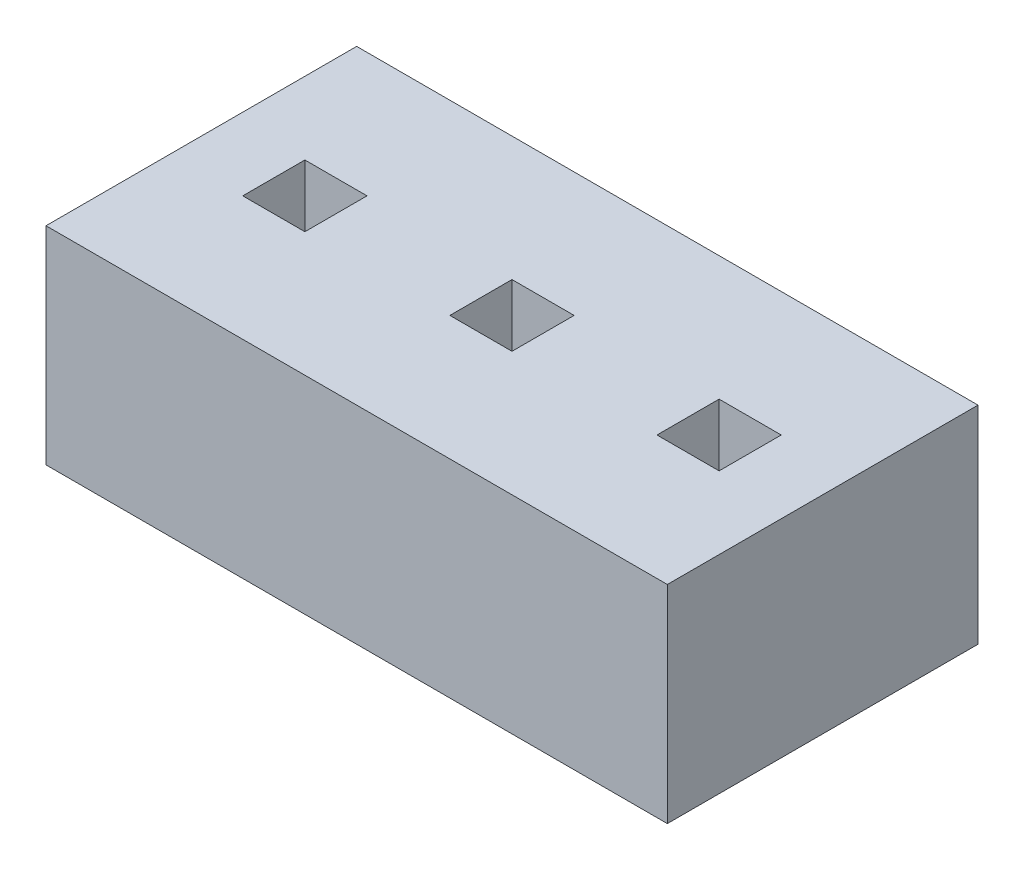
ISO-10303-21;
HEADER;
FILE_DESCRIPTION(('STEP AP214'),'2;1');
FILE_NAME('part.step','',(''),(''),'','','');
FILE_SCHEMA(('AUTOMOTIVE_DESIGN { 1 0 10303 214 1 1 1 1 }'));
ENDSEC;
DATA;
#1=APPLICATION_CONTEXT('core data for automotive mechanical design processes');
#2=APPLICATION_PROTOCOL_DEFINITION('international standard','automotive_design',2000,#1);
#3=PRODUCT_CONTEXT('',#1,'mechanical');
#4=PRODUCT('Part','Part','',(#3));
#5=PRODUCT_RELATED_PRODUCT_CATEGORY('part','',(#4));
#6=PRODUCT_DEFINITION_FORMATION('','',#4);
#7=PRODUCT_DEFINITION_CONTEXT('part definition',#1,'design');
#8=PRODUCT_DEFINITION('design','',#6,#7);
#9=PRODUCT_DEFINITION_SHAPE('','',#8);
#10=(LENGTH_UNIT() NAMED_UNIT(*) SI_UNIT(.MILLI.,.METRE.));
#11=(NAMED_UNIT(*) PLANE_ANGLE_UNIT() SI_UNIT($,.RADIAN.));
#12=(NAMED_UNIT(*) SI_UNIT($,.STERADIAN.) SOLID_ANGLE_UNIT());
#13=UNCERTAINTY_MEASURE_WITH_UNIT(LENGTH_MEASURE(1.E-05),#10,'distance_accuracy_value','');
#14=(GEOMETRIC_REPRESENTATION_CONTEXT(3) GLOBAL_UNCERTAINTY_ASSIGNED_CONTEXT((#13)) GLOBAL_UNIT_ASSIGNED_CONTEXT((#10,
#11,#12)) REPRESENTATION_CONTEXT('',''));
#15=CARTESIAN_POINT('',(0.,0.,0.));
#16=DIRECTION('',(0.,0.,1.));
#17=DIRECTION('',(1.,0.,0.));
#18=AXIS2_PLACEMENT_3D('',#15,#16,#17);
#19=CARTESIAN_POINT('',(0.,1.,0.));
#20=DIRECTION('',(1.,0.,0.));
#21=DIRECTION('',(0.,0.,-1.));
#22=AXIS2_PLACEMENT_3D('',#19,#20,#21);
#23=PLANE('',#22);
#24=DIRECTION('',(0.,0.,1.));
#25=VECTOR('',#24,1.);
#26=CARTESIAN_POINT('',(0.,0.,0.));
#27=LINE('',#26,#25);
#28=CARTESIAN_POINT('',(0.,0.,0.));
#29=VERTEX_POINT('',#28);
#30=CARTESIAN_POINT('',(0.,0.,1.5));
#31=VERTEX_POINT('',#30);
#32=EDGE_CURVE('E11',#29,#31,#27,.T.);
#33=ORIENTED_EDGE('',*,*,#32,.T.);
#34=DIRECTION('',(0.,-1.,0.));
#35=VECTOR('',#34,1.);
#36=CARTESIAN_POINT('',(0.,1.,1.5));
#37=LINE('',#36,#35);
#38=CARTESIAN_POINT('',(0.,1.,1.5));
#39=VERTEX_POINT('',#38);
#40=EDGE_CURVE('E25',#39,#31,#37,.T.);
#41=ORIENTED_EDGE('',*,*,#40,.F.);
#42=DIRECTION('',(0.,0.,1.));
#43=VECTOR('',#42,1.);
#44=CARTESIAN_POINT('',(0.,1.,0.));
#45=LINE('',#44,#43);
#46=CARTESIAN_POINT('',(0.,1.,0.));
#47=VERTEX_POINT('',#46);
#48=EDGE_CURVE('E309',#47,#39,#45,.T.);
#49=ORIENTED_EDGE('',*,*,#48,.F.);
#50=DIRECTION('',(0.,-1.,0.));
#51=VECTOR('',#50,1.);
#52=CARTESIAN_POINT('',(0.,1.,0.));
#53=LINE('',#52,#51);
#54=EDGE_CURVE('E305',#47,#29,#53,.T.);
#55=ORIENTED_EDGE('',*,*,#54,.T.);
#56=EDGE_LOOP('',(#33,#41,#49,#55));
#57=FACE_BOUND('',#56,.T.);
#58=ADVANCED_FACE('F17',(#57),#23,.F.);
#59=CARTESIAN_POINT('',(3.,1.,0.));
#60=DIRECTION('',(0.,0.,1.));
#61=DIRECTION('',(1.,0.,0.));
#62=AXIS2_PLACEMENT_3D('',#59,#60,#61);
#63=PLANE('',#62);
#64=DIRECTION('',(-1.,0.,0.));
#65=VECTOR('',#64,1.);
#66=CARTESIAN_POINT('',(3.,0.,0.));
#67=LINE('',#66,#65);
#68=CARTESIAN_POINT('',(3.,0.,0.));
#69=VERTEX_POINT('',#68);
#70=EDGE_CURVE('E300',#69,#29,#67,.T.);
#71=ORIENTED_EDGE('',*,*,#70,.T.);
#72=ORIENTED_EDGE('',*,*,#54,.F.);
#73=DIRECTION('',(-1.,0.,0.));
#74=VECTOR('',#73,1.);
#75=CARTESIAN_POINT('',(3.,1.,0.));
#76=LINE('',#75,#74);
#77=CARTESIAN_POINT('',(3.,1.,0.));
#78=VERTEX_POINT('',#77);
#79=EDGE_CURVE('E295',#78,#47,#76,.T.);
#80=ORIENTED_EDGE('',*,*,#79,.F.);
#81=DIRECTION('',(0.,-1.,0.));
#82=VECTOR('',#81,1.);
#83=CARTESIAN_POINT('',(3.,1.,0.));
#84=LINE('',#83,#82);
#85=EDGE_CURVE('E291',#78,#69,#84,.T.);
#86=ORIENTED_EDGE('',*,*,#85,.T.);
#87=EDGE_LOOP('',(#71,#72,#80,#86));
#88=FACE_BOUND('',#87,.T.);
#89=ADVANCED_FACE('F327',(#88),#63,.F.);
#90=CARTESIAN_POINT('',(3.,1.,1.5));
#91=DIRECTION('',(-1.,0.,0.));
#92=DIRECTION('',(0.,0.,1.));
#93=AXIS2_PLACEMENT_3D('',#90,#91,#92);
#94=PLANE('',#93);
#95=DIRECTION('',(0.,0.,-1.));
#96=VECTOR('',#95,1.);
#97=CARTESIAN_POINT('',(3.,0.,1.5));
#98=LINE('',#97,#96);
#99=CARTESIAN_POINT('',(3.,0.,1.5));
#100=VERTEX_POINT('',#99);
#101=EDGE_CURVE('E286',#100,#69,#98,.T.);
#102=ORIENTED_EDGE('',*,*,#101,.T.);
#103=ORIENTED_EDGE('',*,*,#85,.F.);
#104=DIRECTION('',(0.,0.,-1.));
#105=VECTOR('',#104,1.);
#106=CARTESIAN_POINT('',(3.,1.,1.5));
#107=LINE('',#106,#105);
#108=CARTESIAN_POINT('',(3.,1.,1.5));
#109=VERTEX_POINT('',#108);
#110=EDGE_CURVE('E281',#109,#78,#107,.T.);
#111=ORIENTED_EDGE('',*,*,#110,.F.);
#112=DIRECTION('',(0.,-1.,0.));
#113=VECTOR('',#112,1.);
#114=CARTESIAN_POINT('',(3.,1.,1.5));
#115=LINE('',#114,#113);
#116=EDGE_CURVE('E277',#109,#100,#115,.T.);
#117=ORIENTED_EDGE('',*,*,#116,.T.);
#118=EDGE_LOOP('',(#102,#103,#111,#117));
#119=FACE_BOUND('',#118,.T.);
#120=ADVANCED_FACE('F331',(#119),#94,.F.);
#121=CARTESIAN_POINT('',(0.,1.,1.5));
#122=DIRECTION('',(0.,0.,-1.));
#123=DIRECTION('',(-1.,0.,0.));
#124=AXIS2_PLACEMENT_3D('',#121,#122,#123);
#125=PLANE('',#124);
#126=DIRECTION('',(1.,0.,0.));
#127=VECTOR('',#126,1.);
#128=CARTESIAN_POINT('',(0.,0.,1.5));
#129=LINE('',#128,#127);
#130=EDGE_CURVE('E272',#31,#100,#129,.T.);
#131=ORIENTED_EDGE('',*,*,#130,.T.);
#132=ORIENTED_EDGE('',*,*,#116,.F.);
#133=DIRECTION('',(1.,0.,0.));
#134=VECTOR('',#133,1.);
#135=CARTESIAN_POINT('',(0.,1.,1.5));
#136=LINE('',#135,#134);
#137=EDGE_CURVE('E267',#39,#109,#136,.T.);
#138=ORIENTED_EDGE('',*,*,#137,.F.);
#139=ORIENTED_EDGE('',*,*,#40,.T.);
#140=EDGE_LOOP('',(#131,#132,#138,#139));
#141=FACE_BOUND('',#140,.T.);
#142=ADVANCED_FACE('F319',(#141),#125,.F.);
#143=CARTESIAN_POINT('',(0.,1.,0.));
#144=DIRECTION('',(0.,1.,0.));
#145=DIRECTION('',(0.,0.,1.));
#146=AXIS2_PLACEMENT_3D('',#143,#144,#145);
#147=PLANE('',#146);
#148=DIRECTION('',(0.,0.,1.));
#149=VECTOR('',#148,1.);
#150=CARTESIAN_POINT('',(0.35,1.,0.6));
#151=LINE('',#150,#149);
#152=CARTESIAN_POINT('',(0.35,1.,0.6));
#153=VERTEX_POINT('',#152);
#154=CARTESIAN_POINT('',(0.35,1.,0.9));
#155=VERTEX_POINT('',#154);
#156=EDGE_CURVE('E262',#153,#155,#151,.T.);
#157=ORIENTED_EDGE('',*,*,#156,.F.);
#158=DIRECTION('',(-1.,0.,0.));
#159=VECTOR('',#158,1.);
#160=CARTESIAN_POINT('',(0.65,1.,0.6));
#161=LINE('',#160,#159);
#162=CARTESIAN_POINT('',(0.65,1.,0.6));
#163=VERTEX_POINT('',#162);
#164=EDGE_CURVE('E257',#163,#153,#161,.T.);
#165=ORIENTED_EDGE('',*,*,#164,.F.);
#166=DIRECTION('',(0.,0.,-1.));
#167=VECTOR('',#166,1.);
#168=CARTESIAN_POINT('',(0.65,1.,0.9));
#169=LINE('',#168,#167);
#170=CARTESIAN_POINT('',(0.65,1.,0.9));
#171=VERTEX_POINT('',#170);
#172=EDGE_CURVE('E252',#171,#163,#169,.T.);
#173=ORIENTED_EDGE('',*,*,#172,.F.);
#174=DIRECTION('',(1.,0.,0.));
#175=VECTOR('',#174,1.);
#176=CARTESIAN_POINT('',(0.35,1.,0.9));
#177=LINE('',#176,#175);
#178=EDGE_CURVE('E247',#155,#171,#177,.T.);
#179=ORIENTED_EDGE('',*,*,#178,.F.);
#180=EDGE_LOOP('',(#157,#165,#173,#179));
#181=FACE_BOUND('',#180,.T.);
#182=DIRECTION('',(0.,0.,1.));
#183=VECTOR('',#182,1.);
#184=CARTESIAN_POINT('',(1.35,1.,0.6));
#185=LINE('',#184,#183);
#186=CARTESIAN_POINT('',(1.35,1.,0.6));
#187=VERTEX_POINT('',#186);
#188=CARTESIAN_POINT('',(1.35,1.,0.9));
#189=VERTEX_POINT('',#188);
#190=EDGE_CURVE('E243',#187,#189,#185,.T.);
#191=ORIENTED_EDGE('',*,*,#190,.F.);
#192=DIRECTION('',(-1.,0.,0.));
#193=VECTOR('',#192,1.);
#194=CARTESIAN_POINT('',(1.65,1.,0.6));
#195=LINE('',#194,#193);
#196=CARTESIAN_POINT('',(1.65,1.,0.6));
#197=VERTEX_POINT('',#196);
#198=EDGE_CURVE('E143',#197,#187,#195,.T.);
#199=ORIENTED_EDGE('',*,*,#198,.F.);
#200=DIRECTION('',(0.,0.,-1.));
#201=VECTOR('',#200,1.);
#202=CARTESIAN_POINT('',(1.65,1.,0.9));
#203=LINE('',#202,#201);
#204=CARTESIAN_POINT('',(1.65,1.,0.9));
#205=VERTEX_POINT('',#204);
#206=EDGE_CURVE('E235',#205,#197,#203,.T.);
#207=ORIENTED_EDGE('',*,*,#206,.F.);
#208=DIRECTION('',(1.,0.,0.));
#209=VECTOR('',#208,1.);
#210=CARTESIAN_POINT('',(1.35,1.,0.9));
#211=LINE('',#210,#209);
#212=EDGE_CURVE('E230',#189,#205,#211,.T.);
#213=ORIENTED_EDGE('',*,*,#212,.F.);
#214=EDGE_LOOP('',(#191,#199,#207,#213));
#215=FACE_BOUND('',#214,.T.);
#216=DIRECTION('',(0.,0.,1.));
#217=VECTOR('',#216,1.);
#218=CARTESIAN_POINT('',(2.35,1.,0.6));
#219=LINE('',#218,#217);
#220=CARTESIAN_POINT('',(2.35,1.,0.6));
#221=VERTEX_POINT('',#220);
#222=CARTESIAN_POINT('',(2.35,1.,0.9));
#223=VERTEX_POINT('',#222);
#224=EDGE_CURVE('E225',#221,#223,#219,.T.);
#225=ORIENTED_EDGE('',*,*,#224,.F.);
#226=DIRECTION('',(-1.,0.,0.));
#227=VECTOR('',#226,1.);
#228=CARTESIAN_POINT('',(2.65,1.,0.6));
#229=LINE('',#228,#227);
#230=CARTESIAN_POINT('',(2.65,1.,0.6));
#231=VERTEX_POINT('',#230);
#232=EDGE_CURVE('E220',#231,#221,#229,.T.);
#233=ORIENTED_EDGE('',*,*,#232,.F.);
#234=DIRECTION('',(0.,0.,-1.));
#235=VECTOR('',#234,1.);
#236=CARTESIAN_POINT('',(2.65,1.,0.9));
#237=LINE('',#236,#235);
#238=CARTESIAN_POINT('',(2.65,1.,0.9));
#239=VERTEX_POINT('',#238);
#240=EDGE_CURVE('E215',#239,#231,#237,.T.);
#241=ORIENTED_EDGE('',*,*,#240,.F.);
#242=DIRECTION('',(1.,0.,0.));
#243=VECTOR('',#242,1.);
#244=CARTESIAN_POINT('',(2.35,1.,0.9));
#245=LINE('',#244,#243);
#246=EDGE_CURVE('E210',#223,#239,#245,.T.);
#247=ORIENTED_EDGE('',*,*,#246,.F.);
#248=EDGE_LOOP('',(#225,#233,#241,#247));
#249=FACE_BOUND('',#248,.T.);
#250=ORIENTED_EDGE('',*,*,#48,.T.);
#251=ORIENTED_EDGE('',*,*,#137,.T.);
#252=ORIENTED_EDGE('',*,*,#110,.T.);
#253=ORIENTED_EDGE('',*,*,#79,.T.);
#254=EDGE_LOOP('',(#250,#251,#252,#253));
#255=FACE_BOUND('',#254,.T.);
#256=ADVANCED_FACE('F323',(#181,#215,#249,#255),#147,.T.);
#257=CARTESIAN_POINT('',(2.35,1.,0.9));
#258=DIRECTION('',(0.,0.,-1.));
#259=DIRECTION('',(-1.,0.,0.));
#260=AXIS2_PLACEMENT_3D('',#257,#258,#259);
#261=PLANE('',#260);
#262=DIRECTION('',(1.,0.,0.));
#263=VECTOR('',#262,1.);
#264=CARTESIAN_POINT('',(2.35,0.,0.9));
#265=LINE('',#264,#263);
#266=CARTESIAN_POINT('',(2.35,0.,0.9));
#267=VERTEX_POINT('',#266);
#268=CARTESIAN_POINT('',(2.65,0.,0.9));
#269=VERTEX_POINT('',#268);
#270=EDGE_CURVE('E205',#267,#269,#265,.T.);
#271=ORIENTED_EDGE('',*,*,#270,.F.);
#272=DIRECTION('',(0.,-1.,0.));
#273=VECTOR('',#272,1.);
#274=CARTESIAN_POINT('',(2.35,1.,0.9));
#275=LINE('',#274,#273);
#276=EDGE_CURVE('E200',#223,#267,#275,.T.);
#277=ORIENTED_EDGE('',*,*,#276,.F.);
#278=ORIENTED_EDGE('',*,*,#246,.T.);
#279=DIRECTION('',(0.,-1.,0.));
#280=VECTOR('',#279,1.);
#281=CARTESIAN_POINT('',(2.65,1.,0.9));
#282=LINE('',#281,#280);
#283=EDGE_CURVE('E196',#239,#269,#282,.T.);
#284=ORIENTED_EDGE('',*,*,#283,.T.);
#285=EDGE_LOOP('',(#271,#277,#278,#284));
#286=FACE_BOUND('',#285,.T.);
#287=ADVANCED_FACE('F374',(#286),#261,.T.);
#288=CARTESIAN_POINT('',(2.65,1.,0.9));
#289=DIRECTION('',(-1.,0.,0.));
#290=DIRECTION('',(0.,0.,1.));
#291=AXIS2_PLACEMENT_3D('',#288,#289,#290);
#292=PLANE('',#291);
#293=DIRECTION('',(0.,0.,-1.));
#294=VECTOR('',#293,1.);
#295=CARTESIAN_POINT('',(2.65,0.,0.9));
#296=LINE('',#295,#294);
#297=CARTESIAN_POINT('',(2.65,0.,0.6));
#298=VERTEX_POINT('',#297);
#299=EDGE_CURVE('E191',#269,#298,#296,.T.);
#300=ORIENTED_EDGE('',*,*,#299,.F.);
#301=ORIENTED_EDGE('',*,*,#283,.F.);
#302=ORIENTED_EDGE('',*,*,#240,.T.);
#303=DIRECTION('',(0.,-1.,0.));
#304=VECTOR('',#303,1.);
#305=CARTESIAN_POINT('',(2.65,1.,0.6));
#306=LINE('',#305,#304);
#307=EDGE_CURVE('E187',#231,#298,#306,.T.);
#308=ORIENTED_EDGE('',*,*,#307,.T.);
#309=EDGE_LOOP('',(#300,#301,#302,#308));
#310=FACE_BOUND('',#309,.T.);
#311=ADVANCED_FACE('F385',(#310),#292,.T.);
#312=CARTESIAN_POINT('',(2.65,1.,0.6));
#313=DIRECTION('',(0.,0.,1.));
#314=DIRECTION('',(1.,0.,0.));
#315=AXIS2_PLACEMENT_3D('',#312,#313,#314);
#316=PLANE('',#315);
#317=DIRECTION('',(-1.,0.,0.));
#318=VECTOR('',#317,1.);
#319=CARTESIAN_POINT('',(2.65,0.,0.6));
#320=LINE('',#319,#318);
#321=CARTESIAN_POINT('',(2.35,0.,0.6));
#322=VERTEX_POINT('',#321);
#323=EDGE_CURVE('E182',#298,#322,#320,.T.);
#324=ORIENTED_EDGE('',*,*,#323,.F.);
#325=ORIENTED_EDGE('',*,*,#307,.F.);
#326=ORIENTED_EDGE('',*,*,#232,.T.);
#327=DIRECTION('',(0.,-1.,0.));
#328=VECTOR('',#327,1.);
#329=CARTESIAN_POINT('',(2.35,1.,0.6));
#330=LINE('',#329,#328);
#331=EDGE_CURVE('E178',#221,#322,#330,.T.);
#332=ORIENTED_EDGE('',*,*,#331,.T.);
#333=EDGE_LOOP('',(#324,#325,#326,#332));
#334=FACE_BOUND('',#333,.T.);
#335=ADVANCED_FACE('F396',(#334),#316,.T.);
#336=CARTESIAN_POINT('',(2.35,1.,0.6));
#337=DIRECTION('',(1.,0.,0.));
#338=DIRECTION('',(0.,0.,-1.));
#339=AXIS2_PLACEMENT_3D('',#336,#337,#338);
#340=PLANE('',#339);
#341=DIRECTION('',(0.,0.,1.));
#342=VECTOR('',#341,1.);
#343=CARTESIAN_POINT('',(2.35,0.,0.6));
#344=LINE('',#343,#342);
#345=EDGE_CURVE('E173',#322,#267,#344,.T.);
#346=ORIENTED_EDGE('',*,*,#345,.F.);
#347=ORIENTED_EDGE('',*,*,#331,.F.);
#348=ORIENTED_EDGE('',*,*,#224,.T.);
#349=ORIENTED_EDGE('',*,*,#276,.T.);
#350=EDGE_LOOP('',(#346,#347,#348,#349));
#351=FACE_BOUND('',#350,.T.);
#352=ADVANCED_FACE('F407',(#351),#340,.T.);
#353=CARTESIAN_POINT('',(0.,0.,0.));
#354=DIRECTION('',(0.,1.,0.));
#355=DIRECTION('',(0.,0.,1.));
#356=AXIS2_PLACEMENT_3D('',#353,#354,#355);
#357=PLANE('',#356);
#358=DIRECTION('',(0.,0.,1.));
#359=VECTOR('',#358,1.);
#360=CARTESIAN_POINT('',(0.35,0.,0.6));
#361=LINE('',#360,#359);
#362=CARTESIAN_POINT('',(0.35,0.,0.6));
#363=VERTEX_POINT('',#362);
#364=CARTESIAN_POINT('',(0.35,0.,0.9));
#365=VERTEX_POINT('',#364);
#366=EDGE_CURVE('E169',#363,#365,#361,.T.);
#367=ORIENTED_EDGE('',*,*,#366,.T.);
#368=DIRECTION('',(1.,0.,0.));
#369=VECTOR('',#368,1.);
#370=CARTESIAN_POINT('',(0.35,0.,0.9));
#371=LINE('',#370,#369);
#372=CARTESIAN_POINT('',(0.65,0.,0.9));
#373=VERTEX_POINT('',#372);
#374=EDGE_CURVE('E165',#365,#373,#371,.T.);
#375=ORIENTED_EDGE('',*,*,#374,.T.);
#376=DIRECTION('',(0.,0.,-1.));
#377=VECTOR('',#376,1.);
#378=CARTESIAN_POINT('',(0.65,0.,0.9));
#379=LINE('',#378,#377);
#380=CARTESIAN_POINT('',(0.65,0.,0.6));
#381=VERTEX_POINT('',#380);
#382=EDGE_CURVE('E154',#373,#381,#379,.T.);
#383=ORIENTED_EDGE('',*,*,#382,.T.);
#384=DIRECTION('',(-1.,0.,0.));
#385=VECTOR('',#384,1.);
#386=CARTESIAN_POINT('',(0.65,0.,0.6));
#387=LINE('',#386,#385);
#388=EDGE_CURVE('E151',#381,#363,#387,.T.);
#389=ORIENTED_EDGE('',*,*,#388,.T.);
#390=EDGE_LOOP('',(#367,#375,#383,#389));
#391=FACE_BOUND('',#390,.T.);
#392=DIRECTION('',(0.,0.,1.));
#393=VECTOR('',#392,1.);
#394=CARTESIAN_POINT('',(1.35,0.,0.6));
#395=LINE('',#394,#393);
#396=CARTESIAN_POINT('',(1.35,0.,0.6));
#397=VERTEX_POINT('',#396);
#398=CARTESIAN_POINT('',(1.35,0.,0.9));
#399=VERTEX_POINT('',#398);
#400=EDGE_CURVE('E130',#397,#399,#395,.T.);
#401=ORIENTED_EDGE('',*,*,#400,.T.);
#402=DIRECTION('',(1.,0.,0.));
#403=VECTOR('',#402,1.);
#404=CARTESIAN_POINT('',(1.35,0.,0.9));
#405=LINE('',#404,#403);
#406=CARTESIAN_POINT('',(1.65,0.,0.9));
#407=VERTEX_POINT('',#406);
#408=EDGE_CURVE('E152',#399,#407,#405,.T.);
#409=ORIENTED_EDGE('',*,*,#408,.T.);
#410=DIRECTION('',(0.,0.,-1.));
#411=VECTOR('',#410,1.);
#412=CARTESIAN_POINT('',(1.65,0.,0.9));
#413=LINE('',#412,#411);
#414=CARTESIAN_POINT('',(1.65,0.,0.6));
#415=VERTEX_POINT('',#414);
#416=EDGE_CURVE('E133',#407,#415,#413,.T.);
#417=ORIENTED_EDGE('',*,*,#416,.T.);
#418=DIRECTION('',(-1.,0.,0.));
#419=VECTOR('',#418,1.);
#420=CARTESIAN_POINT('',(1.65,0.,0.6));
#421=LINE('',#420,#419);
#422=EDGE_CURVE('E125',#415,#397,#421,.T.);
#423=ORIENTED_EDGE('',*,*,#422,.T.);
#424=EDGE_LOOP('',(#401,#409,#417,#423));
#425=FACE_BOUND('',#424,.T.);
#426=ORIENTED_EDGE('',*,*,#345,.T.);
#427=ORIENTED_EDGE('',*,*,#270,.T.);
#428=ORIENTED_EDGE('',*,*,#299,.T.);
#429=ORIENTED_EDGE('',*,*,#323,.T.);
#430=EDGE_LOOP('',(#426,#427,#428,#429));
#431=FACE_BOUND('',#430,.T.);
#432=ORIENTED_EDGE('',*,*,#32,.F.);
#433=ORIENTED_EDGE('',*,*,#70,.F.);
#434=ORIENTED_EDGE('',*,*,#101,.F.);
#435=ORIENTED_EDGE('',*,*,#130,.F.);
#436=EDGE_LOOP('',(#432,#433,#434,#435));
#437=FACE_BOUND('',#436,.T.);
#438=ADVANCED_FACE('F127',(#391,#425,#431,#437),#357,.F.);
#439=CARTESIAN_POINT('',(1.65,1.,0.6));
#440=DIRECTION('',(0.,0.,1.));
#441=DIRECTION('',(1.,0.,0.));
#442=AXIS2_PLACEMENT_3D('',#439,#440,#441);
#443=PLANE('',#442);
#444=ORIENTED_EDGE('',*,*,#422,.F.);
#445=DIRECTION('',(0.,-1.,0.));
#446=VECTOR('',#445,1.);
#447=CARTESIAN_POINT('',(1.65,1.,0.6));
#448=LINE('',#447,#446);
#449=EDGE_CURVE('E137',#197,#415,#448,.T.);
#450=ORIENTED_EDGE('',*,*,#449,.F.);
#451=ORIENTED_EDGE('',*,*,#198,.T.);
#452=DIRECTION('',(0.,-1.,0.));
#453=VECTOR('',#452,1.);
#454=CARTESIAN_POINT('',(1.35,1.,0.6));
#455=LINE('',#454,#453);
#456=EDGE_CURVE('E141',#187,#397,#455,.T.);
#457=ORIENTED_EDGE('',*,*,#456,.T.);
#458=EDGE_LOOP('',(#444,#450,#451,#457));
#459=FACE_BOUND('',#458,.T.);
#460=ADVANCED_FACE('F142',(#459),#443,.T.);
#461=CARTESIAN_POINT('',(1.35,1.,0.6));
#462=DIRECTION('',(1.,0.,0.));
#463=DIRECTION('',(0.,0.,-1.));
#464=AXIS2_PLACEMENT_3D('',#461,#462,#463);
#465=PLANE('',#464);
#466=ORIENTED_EDGE('',*,*,#400,.F.);
#467=ORIENTED_EDGE('',*,*,#456,.F.);
#468=ORIENTED_EDGE('',*,*,#190,.T.);
#469=DIRECTION('',(0.,-1.,0.));
#470=VECTOR('',#469,1.);
#471=CARTESIAN_POINT('',(1.35,1.,0.9));
#472=LINE('',#471,#470);
#473=EDGE_CURVE('E146',#189,#399,#472,.T.);
#474=ORIENTED_EDGE('',*,*,#473,.T.);
#475=EDGE_LOOP('',(#466,#467,#468,#474));
#476=FACE_BOUND('',#475,.T.);
#477=ADVANCED_FACE('F148',(#476),#465,.T.);
#478=CARTESIAN_POINT('',(1.35,1.,0.9));
#479=DIRECTION('',(0.,0.,-1.));
#480=DIRECTION('',(-1.,0.,0.));
#481=AXIS2_PLACEMENT_3D('',#478,#479,#480);
#482=PLANE('',#481);
#483=ORIENTED_EDGE('',*,*,#408,.F.);
#484=ORIENTED_EDGE('',*,*,#473,.F.);
#485=ORIENTED_EDGE('',*,*,#212,.T.);
#486=DIRECTION('',(0.,-1.,0.));
#487=VECTOR('',#486,1.);
#488=CARTESIAN_POINT('',(1.65,1.,0.9));
#489=LINE('',#488,#487);
#490=EDGE_CURVE('E569',#205,#407,#489,.T.);
#491=ORIENTED_EDGE('',*,*,#490,.T.);
#492=EDGE_LOOP('',(#483,#484,#485,#491));
#493=FACE_BOUND('',#492,.T.);
#494=ADVANCED_FACE('F447',(#493),#482,.T.);
#495=CARTESIAN_POINT('',(1.65,1.,0.9));
#496=DIRECTION('',(-1.,0.,0.));
#497=DIRECTION('',(0.,0.,1.));
#498=AXIS2_PLACEMENT_3D('',#495,#496,#497);
#499=PLANE('',#498);
#500=ORIENTED_EDGE('',*,*,#416,.F.);
#501=ORIENTED_EDGE('',*,*,#490,.F.);
#502=ORIENTED_EDGE('',*,*,#206,.T.);
#503=ORIENTED_EDGE('',*,*,#449,.T.);
#504=EDGE_LOOP('',(#500,#501,#502,#503));
#505=FACE_BOUND('',#504,.T.);
#506=ADVANCED_FACE('F457',(#505),#499,.T.);
#507=CARTESIAN_POINT('',(0.65,1.,0.6));
#508=DIRECTION('',(0.,0.,1.));
#509=DIRECTION('',(1.,0.,0.));
#510=AXIS2_PLACEMENT_3D('',#507,#508,#509);
#511=PLANE('',#510);
#512=ORIENTED_EDGE('',*,*,#388,.F.);
#513=DIRECTION('',(0.,-1.,0.));
#514=VECTOR('',#513,1.);
#515=CARTESIAN_POINT('',(0.65,1.,0.6));
#516=LINE('',#515,#514);
#517=EDGE_CURVE('E548',#163,#381,#516,.T.);
#518=ORIENTED_EDGE('',*,*,#517,.F.);
#519=ORIENTED_EDGE('',*,*,#164,.T.);
#520=DIRECTION('',(0.,-1.,0.));
#521=VECTOR('',#520,1.);
#522=CARTESIAN_POINT('',(0.35,1.,0.6));
#523=LINE('',#522,#521);
#524=EDGE_CURVE('E553',#153,#363,#523,.T.);
#525=ORIENTED_EDGE('',*,*,#524,.T.);
#526=EDGE_LOOP('',(#512,#518,#519,#525));
#527=FACE_BOUND('',#526,.T.);
#528=ADVANCED_FACE('F468',(#527),#511,.T.);
#529=CARTESIAN_POINT('',(0.35,1.,0.6));
#530=DIRECTION('',(1.,0.,0.));
#531=DIRECTION('',(0.,0.,-1.));
#532=AXIS2_PLACEMENT_3D('',#529,#530,#531);
#533=PLANE('',#532);
#534=ORIENTED_EDGE('',*,*,#366,.F.);
#535=ORIENTED_EDGE('',*,*,#524,.F.);
#536=ORIENTED_EDGE('',*,*,#156,.T.);
#537=DIRECTION('',(0.,-1.,0.));
#538=VECTOR('',#537,1.);
#539=CARTESIAN_POINT('',(0.35,1.,0.9));
#540=LINE('',#539,#538);
#541=EDGE_CURVE('E555',#155,#365,#540,.T.);
#542=ORIENTED_EDGE('',*,*,#541,.T.);
#543=EDGE_LOOP('',(#534,#535,#536,#542));
#544=FACE_BOUND('',#543,.T.);
#545=ADVANCED_FACE('F479',(#544),#533,.T.);
#546=CARTESIAN_POINT('',(0.35,1.,0.9));
#547=DIRECTION('',(0.,0.,-1.));
#548=DIRECTION('',(-1.,0.,0.));
#549=AXIS2_PLACEMENT_3D('',#546,#547,#548);
#550=PLANE('',#549);
#551=ORIENTED_EDGE('',*,*,#374,.F.);
#552=ORIENTED_EDGE('',*,*,#541,.F.);
#553=ORIENTED_EDGE('',*,*,#178,.T.);
#554=DIRECTION('',(0.,-1.,0.));
#555=VECTOR('',#554,1.);
#556=CARTESIAN_POINT('',(0.65,1.,0.9));
#557=LINE('',#556,#555);
#558=EDGE_CURVE('E546',#171,#373,#557,.T.);
#559=ORIENTED_EDGE('',*,*,#558,.T.);
#560=EDGE_LOOP('',(#551,#552,#553,#559));
#561=FACE_BOUND('',#560,.T.);
#562=ADVANCED_FACE('F490',(#561),#550,.T.);
#563=CARTESIAN_POINT('',(0.65,1.,0.9));
#564=DIRECTION('',(-1.,0.,0.));
#565=DIRECTION('',(0.,0.,1.));
#566=AXIS2_PLACEMENT_3D('',#563,#564,#565);
#567=PLANE('',#566);
#568=ORIENTED_EDGE('',*,*,#382,.F.);
#569=ORIENTED_EDGE('',*,*,#558,.F.);
#570=ORIENTED_EDGE('',*,*,#172,.T.);
#571=ORIENTED_EDGE('',*,*,#517,.T.);
#572=EDGE_LOOP('',(#568,#569,#570,#571));
#573=FACE_BOUND('',#572,.T.);
#574=ADVANCED_FACE('F501',(#573),#567,.T.);
#575=CLOSED_SHELL('',(#58,#89,#120,#142,#256,#287,#311,#335,#352,#438,#460,#477,#494,#506,#528,
#545,#562,#574));
#576=MANIFOLD_SOLID_BREP('B1',#575);
#577=ADVANCED_BREP_SHAPE_REPRESENTATION('',(#18,#576),#14);
#578=SHAPE_DEFINITION_REPRESENTATION(#9,#577);
ENDSEC;
END-ISO-10303-21;
